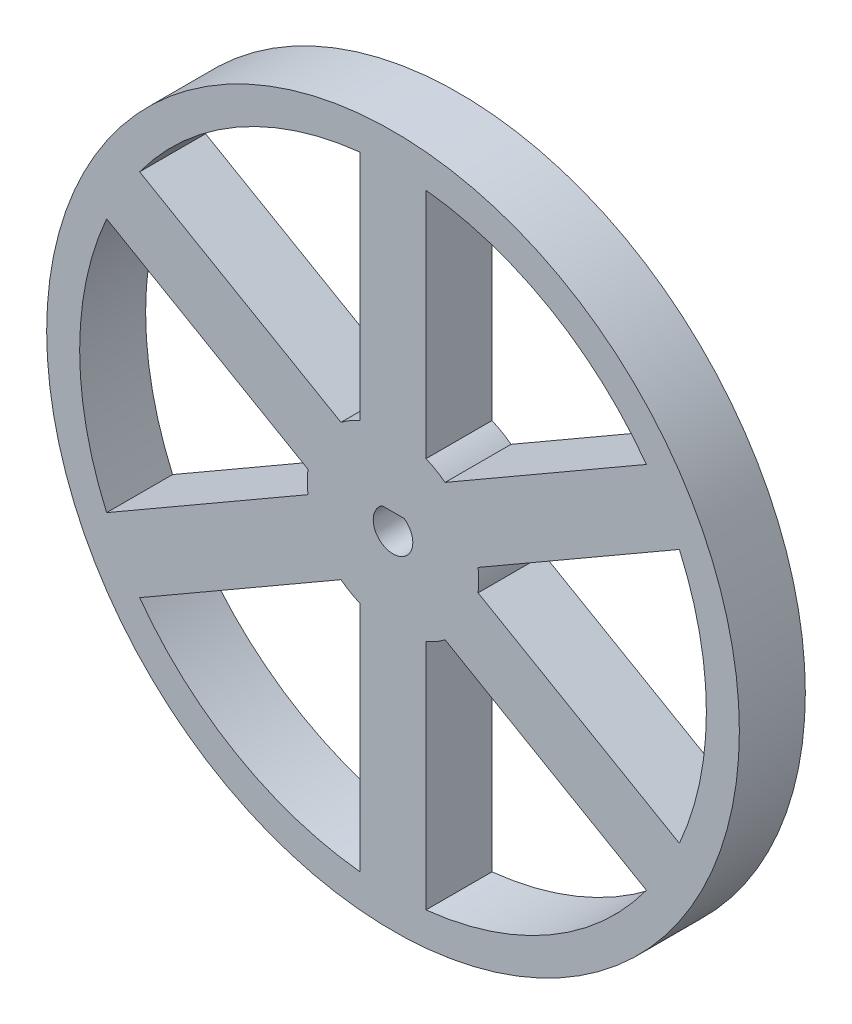
ISO-10303-21;
HEADER;
FILE_DESCRIPTION(('STEP AP214'),'2;1');
FILE_NAME('part.step','',(''),(''),'','','');
FILE_SCHEMA(('AUTOMOTIVE_DESIGN { 1 0 10303 214 1 1 1 1 }'));
ENDSEC;
DATA;
#1=APPLICATION_CONTEXT('core data for automotive mechanical design processes');
#2=APPLICATION_PROTOCOL_DEFINITION('international standard','automotive_design',2000,#1);
#3=PRODUCT_CONTEXT('',#1,'mechanical');
#4=PRODUCT('Part','Part','',(#3));
#5=PRODUCT_RELATED_PRODUCT_CATEGORY('part','',(#4));
#6=PRODUCT_DEFINITION_FORMATION('','',#4);
#7=PRODUCT_DEFINITION_CONTEXT('part definition',#1,'design');
#8=PRODUCT_DEFINITION('design','',#6,#7);
#9=PRODUCT_DEFINITION_SHAPE('','',#8);
#10=(LENGTH_UNIT() NAMED_UNIT(*) SI_UNIT(.MILLI.,.METRE.));
#11=(NAMED_UNIT(*) PLANE_ANGLE_UNIT() SI_UNIT($,.RADIAN.));
#12=(NAMED_UNIT(*) SI_UNIT($,.STERADIAN.) SOLID_ANGLE_UNIT());
#13=UNCERTAINTY_MEASURE_WITH_UNIT(LENGTH_MEASURE(1.E-05),#10,'distance_accuracy_value','');
#14=(GEOMETRIC_REPRESENTATION_CONTEXT(3) GLOBAL_UNCERTAINTY_ASSIGNED_CONTEXT((#13)) GLOBAL_UNIT_ASSIGNED_CONTEXT((#10,
#11,#12)) REPRESENTATION_CONTEXT('',''));
#15=CARTESIAN_POINT('',(0.,0.,0.));
#16=DIRECTION('',(0.,0.,1.));
#17=DIRECTION('',(1.,0.,0.));
#18=AXIS2_PLACEMENT_3D('',#15,#16,#17);
#19=CARTESIAN_POINT('',(0.,0.,10.));
#20=DIRECTION('',(0.,0.,-1.));
#21=DIRECTION('',(-1.,0.,0.));
#22=AXIS2_PLACEMENT_3D('',#19,#20,#21);
#23=CYLINDRICAL_SURFACE('',#22,3.);
#24=CARTESIAN_POINT('',(0.,0.,0.));
#25=DIRECTION('',(0.,0.,1.));
#26=DIRECTION('',(1.,0.,0.));
#27=AXIS2_PLACEMENT_3D('',#24,#25,#26);
#28=CIRCLE('',#27,3.);
#29=CARTESIAN_POINT('',(-1.6583123951777,2.5,0.));
#30=VERTEX_POINT('',#29);
#31=CARTESIAN_POINT('',(1.6583123951777,2.5,0.));
#32=VERTEX_POINT('',#31);
#33=EDGE_CURVE('E412',#30,#32,#28,.T.);
#34=ORIENTED_EDGE('',*,*,#33,.F.);
#35=DIRECTION('',(0.,0.,-1.));
#36=VECTOR('',#35,1.);
#37=CARTESIAN_POINT('',(-1.6583123951777,2.5,10.));
#38=LINE('',#37,#36);
#39=CARTESIAN_POINT('',(-1.6583123951777,2.5,10.));
#40=VERTEX_POINT('',#39);
#41=EDGE_CURVE('E11',#40,#30,#38,.T.);
#42=ORIENTED_EDGE('',*,*,#41,.F.);
#43=CARTESIAN_POINT('',(0.,0.,10.));
#44=DIRECTION('',(0.,0.,1.));
#45=DIRECTION('',(1.,0.,0.));
#46=AXIS2_PLACEMENT_3D('',#43,#44,#45);
#47=CIRCLE('',#46,3.);
#48=CARTESIAN_POINT('',(1.6583123951777,2.5,10.));
#49=VERTEX_POINT('',#48);
#50=EDGE_CURVE('E241',#40,#49,#47,.T.);
#51=ORIENTED_EDGE('',*,*,#50,.T.);
#52=DIRECTION('',(0.,0.,-1.));
#53=VECTOR('',#52,1.);
#54=CARTESIAN_POINT('',(1.6583123951777,2.5,10.));
#55=LINE('',#54,#53);
#56=EDGE_CURVE('E58',#49,#32,#55,.T.);
#57=ORIENTED_EDGE('',*,*,#56,.T.);
#58=EDGE_LOOP('',(#34,#42,#51,#57));
#59=FACE_BOUND('',#58,.T.);
#60=ADVANCED_FACE('F47',(#59),#23,.F.);
#61=CARTESIAN_POINT('',(0.,0.,10.));
#62=DIRECTION('',(0.,0.,-1.));
#63=DIRECTION('',(-1.,0.,0.));
#64=AXIS2_PLACEMENT_3D('',#61,#62,#63);
#65=CYLINDRICAL_SURFACE('',#64,13.);
#66=CARTESIAN_POINT('',(0.,0.,0.));
#67=DIRECTION('',(0.,0.,1.));
#68=DIRECTION('',(1.,0.,0.));
#69=AXIS2_PLACEMENT_3D('',#66,#67,#68);
#70=CIRCLE('',#69,13.);
#71=CARTESIAN_POINT('',(7.89230484541326,10.3301270189222,0.));
#72=VERTEX_POINT('',#71);
#73=CARTESIAN_POINT('',(5.,12.,0.));
#74=VERTEX_POINT('',#73);
#75=EDGE_CURVE('E353',#72,#74,#70,.T.);
#76=ORIENTED_EDGE('',*,*,#75,.T.);
#77=DIRECTION('',(0.,0.,-1.));
#78=VECTOR('',#77,1.);
#79=CARTESIAN_POINT('',(5.,12.,10.));
#80=LINE('',#79,#78);
#81=CARTESIAN_POINT('',(5.,12.,10.));
#82=VERTEX_POINT('',#81);
#83=EDGE_CURVE('E256',#82,#74,#80,.T.);
#84=ORIENTED_EDGE('',*,*,#83,.F.);
#85=CARTESIAN_POINT('',(0.,0.,10.));
#86=DIRECTION('',(0.,0.,1.));
#87=DIRECTION('',(1.,0.,0.));
#88=AXIS2_PLACEMENT_3D('',#85,#86,#87);
#89=CIRCLE('',#88,13.);
#90=CARTESIAN_POINT('',(7.89230484541326,10.3301270189222,10.));
#91=VERTEX_POINT('',#90);
#92=EDGE_CURVE('E235',#91,#82,#89,.T.);
#93=ORIENTED_EDGE('',*,*,#92,.F.);
#94=DIRECTION('',(0.,0.,-1.));
#95=VECTOR('',#94,1.);
#96=CARTESIAN_POINT('',(7.89230484541326,10.3301270189222,10.));
#97=LINE('',#96,#95);
#98=EDGE_CURVE('E244',#91,#72,#97,.T.);
#99=ORIENTED_EDGE('',*,*,#98,.T.);
#100=EDGE_LOOP('',(#76,#84,#93,#99));
#101=FACE_BOUND('',#100,.T.);
#102=ADVANCED_FACE('F255',(#101),#65,.T.);
#103=CARTESIAN_POINT('',(5.,0.,10.));
#104=DIRECTION('',(1.,0.,0.));
#105=DIRECTION('',(0.,0.,-1.));
#106=AXIS2_PLACEMENT_3D('',#103,#104,#105);
#107=PLANE('',#106);
#108=DIRECTION('',(0.,-1.,0.));
#109=VECTOR('',#108,1.);
#110=CARTESIAN_POINT('',(5.,0.,0.));
#111=LINE('',#110,#109);
#112=CARTESIAN_POINT('',(5.,47.236109069228,0.));
#113=VERTEX_POINT('',#112);
#114=EDGE_CURVE('E406',#113,#74,#111,.T.);
#115=ORIENTED_EDGE('',*,*,#114,.F.);
#116=DIRECTION('',(0.,0.,-1.));
#117=VECTOR('',#116,1.);
#118=CARTESIAN_POINT('',(5.,47.236109069228,10.));
#119=LINE('',#118,#117);
#120=CARTESIAN_POINT('',(5.,47.236109069228,10.));
#121=VERTEX_POINT('',#120);
#122=EDGE_CURVE('E422',#121,#113,#119,.T.);
#123=ORIENTED_EDGE('',*,*,#122,.F.);
#124=DIRECTION('',(0.,-1.,0.));
#125=VECTOR('',#124,1.);
#126=CARTESIAN_POINT('',(5.,0.,10.));
#127=LINE('',#126,#125);
#128=EDGE_CURVE('E259',#121,#82,#127,.T.);
#129=ORIENTED_EDGE('',*,*,#128,.T.);
#130=ORIENTED_EDGE('',*,*,#83,.T.);
#131=EDGE_LOOP('',(#115,#123,#129,#130));
#132=FACE_BOUND('',#131,.T.);
#133=ADVANCED_FACE('F516',(#132),#107,.T.);
#134=CARTESIAN_POINT('',(0.,0.,10.));
#135=DIRECTION('',(0.,0.,-1.));
#136=DIRECTION('',(-1.,0.,0.));
#137=AXIS2_PLACEMENT_3D('',#134,#135,#136);
#138=CYLINDRICAL_SURFACE('',#137,47.5);
#139=CARTESIAN_POINT('',(0.,0.,0.));
#140=DIRECTION('',(0.,0.,1.));
#141=DIRECTION('',(1.,0.,0.));
#142=AXIS2_PLACEMENT_3D('',#139,#140,#141);
#143=CIRCLE('',#142,47.5);
#144=CARTESIAN_POINT('',(38.4076704298839,27.9481815535362,0.));
#145=VERTEX_POINT('',#144);
#146=EDGE_CURVE('E363',#145,#113,#143,.T.);
#147=ORIENTED_EDGE('',*,*,#146,.F.);
#148=DIRECTION('',(0.,0.,-1.));
#149=VECTOR('',#148,1.);
#150=CARTESIAN_POINT('',(38.4076704298839,27.9481815535362,10.));
#151=LINE('',#150,#149);
#152=CARTESIAN_POINT('',(38.4076704298839,27.9481815535362,10.));
#153=VERTEX_POINT('',#152);
#154=EDGE_CURVE('E252',#153,#145,#151,.T.);
#155=ORIENTED_EDGE('',*,*,#154,.F.);
#156=CARTESIAN_POINT('',(0.,0.,10.));
#157=DIRECTION('',(0.,0.,1.));
#158=DIRECTION('',(1.,0.,0.));
#159=AXIS2_PLACEMENT_3D('',#156,#157,#158);
#160=CIRCLE('',#159,47.5);
#161=EDGE_CURVE('E238',#153,#121,#160,.T.);
#162=ORIENTED_EDGE('',*,*,#161,.T.);
#163=ORIENTED_EDGE('',*,*,#122,.T.);
#164=EDGE_LOOP('',(#147,#155,#162,#163));
#165=FACE_BOUND('',#164,.T.);
#166=ADVANCED_FACE('F522',(#165),#138,.F.);
#167=CARTESIAN_POINT('',(-5.,0.,10.));
#168=DIRECTION('',(1.,0.,0.));
#169=DIRECTION('',(0.,0.,-1.));
#170=AXIS2_PLACEMENT_3D('',#167,#168,#169);
#171=PLANE('',#170);
#172=DIRECTION('',(0.,-1.,0.));
#173=VECTOR('',#172,1.);
#174=CARTESIAN_POINT('',(-5.,0.,0.));
#175=LINE('',#174,#173);
#176=CARTESIAN_POINT('',(-5.,47.236109069228,0.));
#177=VERTEX_POINT('',#176);
#178=CARTESIAN_POINT('',(-5.,12.,0.));
#179=VERTEX_POINT('',#178);
#180=EDGE_CURVE('E392',#177,#179,#175,.T.);
#181=ORIENTED_EDGE('',*,*,#180,.T.);
#182=DIRECTION('',(0.,0.,-1.));
#183=VECTOR('',#182,1.);
#184=CARTESIAN_POINT('',(-5.,12.,10.));
#185=LINE('',#184,#183);
#186=CARTESIAN_POINT('',(-5.,12.,10.));
#187=VERTEX_POINT('',#186);
#188=EDGE_CURVE('E253',#187,#179,#185,.T.);
#189=ORIENTED_EDGE('',*,*,#188,.F.);
#190=DIRECTION('',(0.,-1.,0.));
#191=VECTOR('',#190,1.);
#192=CARTESIAN_POINT('',(-5.,0.,10.));
#193=LINE('',#192,#191);
#194=CARTESIAN_POINT('',(-5.,47.236109069228,10.));
#195=VERTEX_POINT('',#194);
#196=EDGE_CURVE('E273',#195,#187,#193,.T.);
#197=ORIENTED_EDGE('',*,*,#196,.F.);
#198=DIRECTION('',(0.,0.,-1.));
#199=VECTOR('',#198,1.);
#200=CARTESIAN_POINT('',(-5.,47.236109069228,10.));
#201=LINE('',#200,#199);
#202=EDGE_CURVE('E427',#195,#177,#201,.T.);
#203=ORIENTED_EDGE('',*,*,#202,.T.);
#204=EDGE_LOOP('',(#181,#189,#197,#203));
#205=FACE_BOUND('',#204,.T.);
#206=ADVANCED_FACE('F525',(#205),#171,.F.);
#207=CARTESIAN_POINT('',(-7.89230484541327,10.3301270189222,0.));
#208=VERTEX_POINT('',#207);
#209=EDGE_CURVE('E396',#179,#208,#70,.T.);
#210=ORIENTED_EDGE('',*,*,#209,.T.);
#211=DIRECTION('',(0.,0.,-1.));
#212=VECTOR('',#211,1.);
#213=CARTESIAN_POINT('',(-7.89230484541327,10.3301270189222,10.));
#214=LINE('',#213,#212);
#215=CARTESIAN_POINT('',(-7.89230484541327,10.3301270189222,10.));
#216=VERTEX_POINT('',#215);
#217=EDGE_CURVE('E434',#216,#208,#214,.T.);
#218=ORIENTED_EDGE('',*,*,#217,.F.);
#219=EDGE_CURVE('E262',#187,#216,#89,.T.);
#220=ORIENTED_EDGE('',*,*,#219,.F.);
#221=ORIENTED_EDGE('',*,*,#188,.T.);
#222=EDGE_LOOP('',(#210,#218,#220,#221));
#223=FACE_BOUND('',#222,.T.);
#224=ADVANCED_FACE('F517',(#223),#65,.T.);
#225=CARTESIAN_POINT('',(2.5,4.3301270189222,10.));
#226=DIRECTION('',(0.499999999999999,0.866025403784439,0.));
#227=DIRECTION('',(-0.866025403784439,0.499999999999999,0.));
#228=AXIS2_PLACEMENT_3D('',#225,#226,#227);
#229=PLANE('',#228);
#230=DIRECTION('',(0.866025403784439,-0.499999999999999,0.));
#231=VECTOR('',#230,1.);
#232=CARTESIAN_POINT('',(2.5,4.3301270189222,0.));
#233=LINE('',#232,#231);
#234=CARTESIAN_POINT('',(-38.407670429884,27.9481815535361,0.));
#235=VERTEX_POINT('',#234);
#236=EDGE_CURVE('E397',#235,#208,#233,.T.);
#237=ORIENTED_EDGE('',*,*,#236,.F.);
#238=DIRECTION('',(0.,0.,-1.));
#239=VECTOR('',#238,1.);
#240=CARTESIAN_POINT('',(-38.407670429884,27.9481815535361,10.));
#241=LINE('',#240,#239);
#242=CARTESIAN_POINT('',(-38.407670429884,27.9481815535361,10.));
#243=VERTEX_POINT('',#242);
#244=EDGE_CURVE('E430',#243,#235,#241,.T.);
#245=ORIENTED_EDGE('',*,*,#244,.F.);
#246=DIRECTION('',(0.866025403784439,-0.499999999999999,0.));
#247=VECTOR('',#246,1.);
#248=CARTESIAN_POINT('',(2.5,4.3301270189222,10.));
#249=LINE('',#248,#247);
#250=EDGE_CURVE('E272',#243,#216,#249,.T.);
#251=ORIENTED_EDGE('',*,*,#250,.T.);
#252=ORIENTED_EDGE('',*,*,#217,.T.);
#253=EDGE_LOOP('',(#237,#245,#251,#252));
#254=FACE_BOUND('',#253,.T.);
#255=ADVANCED_FACE('F534',(#254),#229,.T.);
#256=CARTESIAN_POINT('',(-2.5,-4.33012701892219,10.));
#257=DIRECTION('',(0.499999999999999,0.866025403784439,0.));
#258=DIRECTION('',(-0.866025403784439,0.499999999999999,0.));
#259=AXIS2_PLACEMENT_3D('',#256,#257,#258);
#260=PLANE('',#259);
#261=DIRECTION('',(0.866025403784439,-0.499999999999999,0.));
#262=VECTOR('',#261,1.);
#263=CARTESIAN_POINT('',(-2.5,-4.33012701892219,0.));
#264=LINE('',#263,#262);
#265=CARTESIAN_POINT('',(-43.407670429884,19.2879275156918,0.));
#266=VERTEX_POINT('',#265);
#267=CARTESIAN_POINT('',(-12.8923048454133,1.6698729810778,0.));
#268=VERTEX_POINT('',#267);
#269=EDGE_CURVE('E382',#266,#268,#264,.T.);
#270=ORIENTED_EDGE('',*,*,#269,.T.);
#271=DIRECTION('',(0.,0.,-1.));
#272=VECTOR('',#271,1.);
#273=CARTESIAN_POINT('',(-12.8923048454133,1.6698729810778,10.));
#274=LINE('',#273,#272);
#275=CARTESIAN_POINT('',(-12.8923048454133,1.6698729810778,10.));
#276=VERTEX_POINT('',#275);
#277=EDGE_CURVE('E431',#276,#268,#274,.T.);
#278=ORIENTED_EDGE('',*,*,#277,.F.);
#279=DIRECTION('',(0.866025403784439,-0.499999999999999,0.));
#280=VECTOR('',#279,1.);
#281=CARTESIAN_POINT('',(-2.5,-4.33012701892219,10.));
#282=LINE('',#281,#280);
#283=CARTESIAN_POINT('',(-43.407670429884,19.2879275156918,10.));
#284=VERTEX_POINT('',#283);
#285=EDGE_CURVE('E315',#284,#276,#282,.T.);
#286=ORIENTED_EDGE('',*,*,#285,.F.);
#287=DIRECTION('',(0.,0.,-1.));
#288=VECTOR('',#287,1.);
#289=CARTESIAN_POINT('',(-43.407670429884,19.2879275156918,10.));
#290=LINE('',#289,#288);
#291=EDGE_CURVE('E440',#284,#266,#290,.T.);
#292=ORIENTED_EDGE('',*,*,#291,.T.);
#293=EDGE_LOOP('',(#270,#278,#286,#292));
#294=FACE_BOUND('',#293,.T.);
#295=ADVANCED_FACE('F537',(#294),#260,.F.);
#296=CARTESIAN_POINT('',(-12.8923048454133,-1.66987298107781,0.));
#297=VERTEX_POINT('',#296);
#298=EDGE_CURVE('E386',#268,#297,#70,.T.);
#299=ORIENTED_EDGE('',*,*,#298,.T.);
#300=DIRECTION('',(0.,0.,-1.));
#301=VECTOR('',#300,1.);
#302=CARTESIAN_POINT('',(-12.8923048454133,-1.66987298107781,10.));
#303=LINE('',#302,#301);
#304=CARTESIAN_POINT('',(-12.8923048454133,-1.66987298107781,10.));
#305=VERTEX_POINT('',#304);
#306=EDGE_CURVE('E447',#305,#297,#303,.T.);
#307=ORIENTED_EDGE('',*,*,#306,.F.);
#308=EDGE_CURVE('E274',#276,#305,#89,.T.);
#309=ORIENTED_EDGE('',*,*,#308,.F.);
#310=ORIENTED_EDGE('',*,*,#277,.T.);
#311=EDGE_LOOP('',(#299,#307,#309,#310));
#312=FACE_BOUND('',#311,.T.);
#313=ADVANCED_FACE('F546',(#312),#65,.T.);
#314=CARTESIAN_POINT('',(-2.5,4.33012701892219,10.));
#315=DIRECTION('',(-0.5,0.866025403784438,0.));
#316=DIRECTION('',(-0.866025403784438,-0.5,0.));
#317=AXIS2_PLACEMENT_3D('',#314,#315,#316);
#318=PLANE('',#317);
#319=DIRECTION('',(0.866025403784438,0.5,0.));
#320=VECTOR('',#319,1.);
#321=CARTESIAN_POINT('',(-2.5,4.33012701892219,0.));
#322=LINE('',#321,#320);
#323=CARTESIAN_POINT('',(-43.4076704298839,-19.2879275156918,0.));
#324=VERTEX_POINT('',#323);
#325=EDGE_CURVE('E387',#324,#297,#322,.T.);
#326=ORIENTED_EDGE('',*,*,#325,.F.);
#327=DIRECTION('',(0.,0.,-1.));
#328=VECTOR('',#327,1.);
#329=CARTESIAN_POINT('',(-43.4076704298839,-19.2879275156918,10.));
#330=LINE('',#329,#328);
#331=CARTESIAN_POINT('',(-43.4076704298839,-19.2879275156918,10.));
#332=VERTEX_POINT('',#331);
#333=EDGE_CURVE('E443',#332,#324,#330,.T.);
#334=ORIENTED_EDGE('',*,*,#333,.F.);
#335=DIRECTION('',(0.866025403784438,0.5,0.));
#336=VECTOR('',#335,1.);
#337=CARTESIAN_POINT('',(-2.5,4.33012701892219,10.));
#338=LINE('',#337,#336);
#339=EDGE_CURVE('E314',#332,#305,#338,.T.);
#340=ORIENTED_EDGE('',*,*,#339,.T.);
#341=ORIENTED_EDGE('',*,*,#306,.T.);
#342=EDGE_LOOP('',(#326,#334,#340,#341));
#343=FACE_BOUND('',#342,.T.);
#344=ADVANCED_FACE('F542',(#343),#318,.T.);
#345=CARTESIAN_POINT('',(2.5,-4.33012701892219,10.));
#346=DIRECTION('',(-0.5,0.866025403784438,0.));
#347=DIRECTION('',(-0.866025403784438,-0.5,0.));
#348=AXIS2_PLACEMENT_3D('',#345,#346,#347);
#349=PLANE('',#348);
#350=DIRECTION('',(0.866025403784438,0.5,0.));
#351=VECTOR('',#350,1.);
#352=CARTESIAN_POINT('',(2.5,-4.33012701892219,0.));
#353=LINE('',#352,#351);
#354=CARTESIAN_POINT('',(-38.4076704298839,-27.9481815535362,0.));
#355=VERTEX_POINT('',#354);
#356=CARTESIAN_POINT('',(-7.89230484541326,-10.3301270189222,0.));
#357=VERTEX_POINT('',#356);
#358=EDGE_CURVE('E372',#355,#357,#353,.T.);
#359=ORIENTED_EDGE('',*,*,#358,.T.);
#360=DIRECTION('',(0.,0.,-1.));
#361=VECTOR('',#360,1.);
#362=CARTESIAN_POINT('',(-7.89230484541326,-10.3301270189222,10.));
#363=LINE('',#362,#361);
#364=CARTESIAN_POINT('',(-7.89230484541326,-10.3301270189222,10.));
#365=VERTEX_POINT('',#364);
#366=EDGE_CURVE('E444',#365,#357,#363,.T.);
#367=ORIENTED_EDGE('',*,*,#366,.F.);
#368=DIRECTION('',(0.866025403784438,0.5,0.));
#369=VECTOR('',#368,1.);
#370=CARTESIAN_POINT('',(2.5,-4.33012701892219,10.));
#371=LINE('',#370,#369);
#372=CARTESIAN_POINT('',(-38.4076704298839,-27.9481815535362,10.));
#373=VERTEX_POINT('',#372);
#374=EDGE_CURVE('E302',#373,#365,#371,.T.);
#375=ORIENTED_EDGE('',*,*,#374,.F.);
#376=DIRECTION('',(0.,0.,-1.));
#377=VECTOR('',#376,1.);
#378=CARTESIAN_POINT('',(-38.4076704298839,-27.9481815535362,10.));
#379=LINE('',#378,#377);
#380=EDGE_CURVE('E453',#373,#355,#379,.T.);
#381=ORIENTED_EDGE('',*,*,#380,.T.);
#382=EDGE_LOOP('',(#359,#367,#375,#381));
#383=FACE_BOUND('',#382,.T.);
#384=ADVANCED_FACE('F545',(#383),#349,.F.);
#385=CARTESIAN_POINT('',(-5.,-12.,0.));
#386=VERTEX_POINT('',#385);
#387=EDGE_CURVE('E376',#357,#386,#70,.T.);
#388=ORIENTED_EDGE('',*,*,#387,.T.);
#389=DIRECTION('',(0.,0.,-1.));
#390=VECTOR('',#389,1.);
#391=CARTESIAN_POINT('',(-5.,-12.,10.));
#392=LINE('',#391,#390);
#393=CARTESIAN_POINT('',(-5.,-12.,10.));
#394=VERTEX_POINT('',#393);
#395=EDGE_CURVE('E460',#394,#386,#392,.T.);
#396=ORIENTED_EDGE('',*,*,#395,.F.);
#397=EDGE_CURVE('E289',#365,#394,#89,.T.);
#398=ORIENTED_EDGE('',*,*,#397,.F.);
#399=ORIENTED_EDGE('',*,*,#366,.T.);
#400=EDGE_LOOP('',(#388,#396,#398,#399));
#401=FACE_BOUND('',#400,.T.);
#402=ADVANCED_FACE('F555',(#401),#65,.T.);
#403=CARTESIAN_POINT('',(-4.99999999999999,0.,10.));
#404=DIRECTION('',(-1.,0.,0.));
#405=DIRECTION('',(0.,-1.,0.));
#406=AXIS2_PLACEMENT_3D('',#403,#404,#405);
#407=PLANE('',#406);
#408=DIRECTION('',(0.,1.,0.));
#409=VECTOR('',#408,1.);
#410=CARTESIAN_POINT('',(-4.99999999999999,0.,0.));
#411=LINE('',#410,#409);
#412=CARTESIAN_POINT('',(-5.,-47.236109069228,0.));
#413=VERTEX_POINT('',#412);
#414=EDGE_CURVE('E377',#413,#386,#411,.T.);
#415=ORIENTED_EDGE('',*,*,#414,.F.);
#416=DIRECTION('',(0.,0.,-1.));
#417=VECTOR('',#416,1.);
#418=CARTESIAN_POINT('',(-5.,-47.236109069228,10.));
#419=LINE('',#418,#417);
#420=CARTESIAN_POINT('',(-5.,-47.236109069228,10.));
#421=VERTEX_POINT('',#420);
#422=EDGE_CURVE('E456',#421,#413,#419,.T.);
#423=ORIENTED_EDGE('',*,*,#422,.F.);
#424=DIRECTION('',(0.,1.,0.));
#425=VECTOR('',#424,1.);
#426=CARTESIAN_POINT('',(-4.99999999999999,0.,10.));
#427=LINE('',#426,#425);
#428=EDGE_CURVE('E301',#421,#394,#427,.T.);
#429=ORIENTED_EDGE('',*,*,#428,.T.);
#430=ORIENTED_EDGE('',*,*,#395,.T.);
#431=EDGE_LOOP('',(#415,#423,#429,#430));
#432=FACE_BOUND('',#431,.T.);
#433=ADVANCED_FACE('F551',(#432),#407,.T.);
#434=CARTESIAN_POINT('',(5.00000000000001,0.,10.));
#435=DIRECTION('',(-1.,0.,0.));
#436=DIRECTION('',(0.,-1.,0.));
#437=AXIS2_PLACEMENT_3D('',#434,#435,#436);
#438=PLANE('',#437);
#439=DIRECTION('',(0.,1.,0.));
#440=VECTOR('',#439,1.);
#441=CARTESIAN_POINT('',(5.00000000000001,0.,0.));
#442=LINE('',#441,#440);
#443=CARTESIAN_POINT('',(5.,-47.236109069228,0.));
#444=VERTEX_POINT('',#443);
#445=CARTESIAN_POINT('',(5.00000000000001,-12.,0.));
#446=VERTEX_POINT('',#445);
#447=EDGE_CURVE('E362',#444,#446,#442,.T.);
#448=ORIENTED_EDGE('',*,*,#447,.T.);
#449=DIRECTION('',(0.,0.,-1.));
#450=VECTOR('',#449,1.);
#451=CARTESIAN_POINT('',(5.00000000000001,-12.,10.));
#452=LINE('',#451,#450);
#453=CARTESIAN_POINT('',(5.00000000000001,-12.,10.));
#454=VERTEX_POINT('',#453);
#455=EDGE_CURVE('E457',#454,#446,#452,.T.);
#456=ORIENTED_EDGE('',*,*,#455,.F.);
#457=DIRECTION('',(0.,1.,0.));
#458=VECTOR('',#457,1.);
#459=CARTESIAN_POINT('',(5.00000000000001,0.,10.));
#460=LINE('',#459,#458);
#461=CARTESIAN_POINT('',(5.,-47.236109069228,10.));
#462=VERTEX_POINT('',#461);
#463=EDGE_CURVE('E288',#462,#454,#460,.T.);
#464=ORIENTED_EDGE('',*,*,#463,.F.);
#465=DIRECTION('',(0.,0.,-1.));
#466=VECTOR('',#465,1.);
#467=CARTESIAN_POINT('',(5.,-47.236109069228,10.));
#468=LINE('',#467,#466);
#469=EDGE_CURVE('E466',#462,#444,#468,.T.);
#470=ORIENTED_EDGE('',*,*,#469,.T.);
#471=EDGE_LOOP('',(#448,#456,#464,#470));
#472=FACE_BOUND('',#471,.T.);
#473=ADVANCED_FACE('F554',(#472),#438,.F.);
#474=CARTESIAN_POINT('',(7.89230484541327,-10.3301270189222,0.));
#475=VERTEX_POINT('',#474);
#476=EDGE_CURVE('E354',#446,#475,#70,.T.);
#477=ORIENTED_EDGE('',*,*,#476,.T.);
#478=DIRECTION('',(0.,0.,-1.));
#479=VECTOR('',#478,1.);
#480=CARTESIAN_POINT('',(7.89230484541327,-10.3301270189222,10.));
#481=LINE('',#480,#479);
#482=CARTESIAN_POINT('',(7.89230484541327,-10.3301270189222,10.));
#483=VERTEX_POINT('',#482);
#484=EDGE_CURVE('E472',#483,#475,#481,.T.);
#485=ORIENTED_EDGE('',*,*,#484,.F.);
#486=EDGE_CURVE('E278',#454,#483,#89,.T.);
#487=ORIENTED_EDGE('',*,*,#486,.F.);
#488=ORIENTED_EDGE('',*,*,#455,.T.);
#489=EDGE_LOOP('',(#477,#485,#487,#488));
#490=FACE_BOUND('',#489,.T.);
#491=ADVANCED_FACE('F509',(#490),#65,.T.);
#492=CARTESIAN_POINT('',(-2.5,-4.33012701892218,10.));
#493=DIRECTION('',(-0.5,-0.866025403784438,0.));
#494=DIRECTION('',(0.866025403784439,-0.5,0.));
#495=AXIS2_PLACEMENT_3D('',#492,#493,#494);
#496=PLANE('',#495);
#497=DIRECTION('',(-0.866025403784439,0.5,0.));
#498=VECTOR('',#497,1.);
#499=CARTESIAN_POINT('',(-2.5,-4.33012701892218,0.));
#500=LINE('',#499,#498);
#501=CARTESIAN_POINT('',(38.4076704298839,-27.9481815535362,0.));
#502=VERTEX_POINT('',#501);
#503=EDGE_CURVE('E368',#502,#475,#500,.T.);
#504=ORIENTED_EDGE('',*,*,#503,.F.);
#505=DIRECTION('',(0.,0.,-1.));
#506=VECTOR('',#505,1.);
#507=CARTESIAN_POINT('',(38.4076704298839,-27.9481815535362,10.));
#508=LINE('',#507,#506);
#509=CARTESIAN_POINT('',(38.4076704298839,-27.9481815535362,10.));
#510=VERTEX_POINT('',#509);
#511=EDGE_CURVE('E469',#510,#502,#508,.T.);
#512=ORIENTED_EDGE('',*,*,#511,.F.);
#513=DIRECTION('',(-0.866025403784439,0.5,0.));
#514=VECTOR('',#513,1.);
#515=CARTESIAN_POINT('',(-2.5,-4.33012701892218,10.));
#516=LINE('',#515,#514);
#517=EDGE_CURVE('E287',#510,#483,#516,.T.);
#518=ORIENTED_EDGE('',*,*,#517,.T.);
#519=ORIENTED_EDGE('',*,*,#484,.T.);
#520=EDGE_LOOP('',(#504,#512,#518,#519));
#521=FACE_BOUND('',#520,.T.);
#522=ADVANCED_FACE('F560',(#521),#496,.T.);
#523=CARTESIAN_POINT('',(2.50000000000001,4.33012701892221,10.));
#524=DIRECTION('',(-0.5,-0.866025403784438,0.));
#525=DIRECTION('',(0.866025403784439,-0.5,0.));
#526=AXIS2_PLACEMENT_3D('',#523,#524,#525);
#527=PLANE('',#526);
#528=DIRECTION('',(-0.866025403784439,0.5,0.));
#529=VECTOR('',#528,1.);
#530=CARTESIAN_POINT('',(2.50000000000001,4.33012701892221,0.));
#531=LINE('',#530,#529);
#532=CARTESIAN_POINT('',(43.4076704298839,-19.2879275156918,0.));
#533=VERTEX_POINT('',#532);
#534=CARTESIAN_POINT('',(12.8923048454133,-1.66987298107779,0.));
#535=VERTEX_POINT('',#534);
#536=EDGE_CURVE('E344',#533,#535,#531,.T.);
#537=ORIENTED_EDGE('',*,*,#536,.T.);
#538=DIRECTION('',(0.,0.,-1.));
#539=VECTOR('',#538,1.);
#540=CARTESIAN_POINT('',(12.8923048454133,-1.66987298107779,10.));
#541=LINE('',#540,#539);
#542=CARTESIAN_POINT('',(12.8923048454133,-1.66987298107779,10.));
#543=VERTEX_POINT('',#542);
#544=EDGE_CURVE('E51',#543,#535,#541,.T.);
#545=ORIENTED_EDGE('',*,*,#544,.F.);
#546=DIRECTION('',(-0.866025403784439,0.5,0.));
#547=VECTOR('',#546,1.);
#548=CARTESIAN_POINT('',(2.50000000000001,4.33012701892221,10.));
#549=LINE('',#548,#547);
#550=CARTESIAN_POINT('',(43.4076704298839,-19.2879275156918,10.));
#551=VERTEX_POINT('',#550);
#552=EDGE_CURVE('E277',#551,#543,#549,.T.);
#553=ORIENTED_EDGE('',*,*,#552,.F.);
#554=DIRECTION('',(0.,0.,-1.));
#555=VECTOR('',#554,1.);
#556=CARTESIAN_POINT('',(43.4076704298839,-19.2879275156918,10.));
#557=LINE('',#556,#555);
#558=EDGE_CURVE('E343',#551,#533,#557,.T.);
#559=ORIENTED_EDGE('',*,*,#558,.T.);
#560=EDGE_LOOP('',(#537,#545,#553,#559));
#561=FACE_BOUND('',#560,.T.);
#562=ADVANCED_FACE('F49',(#561),#527,.F.);
#563=CARTESIAN_POINT('',(12.8923048454133,1.66987298107781,0.));
#564=VERTEX_POINT('',#563);
#565=EDGE_CURVE('E348',#535,#564,#70,.T.);
#566=ORIENTED_EDGE('',*,*,#565,.T.);
#567=DIRECTION('',(0.,0.,-1.));
#568=VECTOR('',#567,1.);
#569=CARTESIAN_POINT('',(12.8923048454133,1.66987298107781,10.));
#570=LINE('',#569,#568);
#571=CARTESIAN_POINT('',(12.8923048454133,1.66987298107781,10.));
#572=VERTEX_POINT('',#571);
#573=EDGE_CURVE('E482',#572,#564,#570,.T.);
#574=ORIENTED_EDGE('',*,*,#573,.F.);
#575=EDGE_CURVE('E160',#543,#572,#89,.T.);
#576=ORIENTED_EDGE('',*,*,#575,.F.);
#577=ORIENTED_EDGE('',*,*,#544,.T.);
#578=EDGE_LOOP('',(#566,#574,#576,#577));
#579=FACE_BOUND('',#578,.T.);
#580=ADVANCED_FACE('F488',(#579),#65,.T.);
#581=CARTESIAN_POINT('',(2.5,-4.33012701892219,10.));
#582=DIRECTION('',(0.5,-0.866025403784439,0.));
#583=DIRECTION('',(0.866025403784439,0.5,0.));
#584=AXIS2_PLACEMENT_3D('',#581,#582,#583);
#585=PLANE('',#584);
#586=DIRECTION('',(-0.866025403784439,-0.5,0.));
#587=VECTOR('',#586,1.);
#588=CARTESIAN_POINT('',(2.5,-4.33012701892219,0.));
#589=LINE('',#588,#587);
#590=CARTESIAN_POINT('',(43.4076704298839,19.2879275156918,0.));
#591=VERTEX_POINT('',#590);
#592=EDGE_CURVE('E352',#591,#564,#589,.T.);
#593=ORIENTED_EDGE('',*,*,#592,.F.);
#594=DIRECTION('',(0.,0.,-1.));
#595=VECTOR('',#594,1.);
#596=CARTESIAN_POINT('',(43.4076704298839,19.2879275156918,10.));
#597=LINE('',#596,#595);
#598=CARTESIAN_POINT('',(43.4076704298839,19.2879275156918,10.));
#599=VERTEX_POINT('',#598);
#600=EDGE_CURVE('E480',#599,#591,#597,.T.);
#601=ORIENTED_EDGE('',*,*,#600,.F.);
#602=DIRECTION('',(-0.866025403784439,-0.5,0.));
#603=VECTOR('',#602,1.);
#604=CARTESIAN_POINT('',(2.5,-4.33012701892219,10.));
#605=LINE('',#604,#603);
#606=EDGE_CURVE('E276',#599,#572,#605,.T.);
#607=ORIENTED_EDGE('',*,*,#606,.T.);
#608=ORIENTED_EDGE('',*,*,#573,.T.);
#609=EDGE_LOOP('',(#593,#601,#607,#608));
#610=FACE_BOUND('',#609,.T.);
#611=ADVANCED_FACE('F500',(#610),#585,.T.);
#612=CARTESIAN_POINT('',(-2.5,4.3301270189222,10.));
#613=DIRECTION('',(0.5,-0.866025403784439,0.));
#614=DIRECTION('',(0.866025403784439,0.5,0.));
#615=AXIS2_PLACEMENT_3D('',#612,#613,#614);
#616=PLANE('',#615);
#617=DIRECTION('',(-0.866025403784439,-0.5,0.));
#618=VECTOR('',#617,1.);
#619=CARTESIAN_POINT('',(-2.5,4.3301270189222,0.));
#620=LINE('',#619,#618);
#621=EDGE_CURVE('E247',#145,#72,#620,.T.);
#622=ORIENTED_EDGE('',*,*,#621,.T.);
#623=ORIENTED_EDGE('',*,*,#98,.F.);
#624=DIRECTION('',(-0.866025403784439,-0.5,0.));
#625=VECTOR('',#624,1.);
#626=CARTESIAN_POINT('',(-2.5,4.3301270189222,10.));
#627=LINE('',#626,#625);
#628=EDGE_CURVE('E230',#153,#91,#627,.T.);
#629=ORIENTED_EDGE('',*,*,#628,.F.);
#630=ORIENTED_EDGE('',*,*,#154,.T.);
#631=EDGE_LOOP('',(#622,#623,#629,#630));
#632=FACE_BOUND('',#631,.T.);
#633=ADVANCED_FACE('F245',(#632),#616,.F.);
#634=CARTESIAN_POINT('',(0.,0.,10.));
#635=DIRECTION('',(0.,0.,-1.));
#636=DIRECTION('',(-1.,0.,0.));
#637=AXIS2_PLACEMENT_3D('',#634,#635,#636);
#638=CYLINDRICAL_SURFACE('',#637,52.5);
#639=CARTESIAN_POINT('',(0.,0.,10.));
#640=DIRECTION('',(0.,0.,1.));
#641=DIRECTION('',(1.,0.,0.));
#642=AXIS2_PLACEMENT_3D('',#639,#640,#641);
#643=CIRCLE('',#642,52.5);
#644=CARTESIAN_POINT('',(52.5,0.,10.));
#645=VERTEX_POINT('',#644);
#646=EDGE_CURVE('E260',#645,#645,#643,.T.);
#647=ORIENTED_EDGE('',*,*,#646,.F.);
#648=EDGE_LOOP('',(#647));
#649=FACE_BOUND('',#648,.T.);
#650=CARTESIAN_POINT('',(0.,0.,0.));
#651=DIRECTION('',(0.,0.,1.));
#652=DIRECTION('',(1.,0.,0.));
#653=AXIS2_PLACEMENT_3D('',#650,#651,#652);
#654=CIRCLE('',#653,52.5);
#655=CARTESIAN_POINT('',(52.5,0.,0.));
#656=VERTEX_POINT('',#655);
#657=EDGE_CURVE('E402',#656,#656,#654,.T.);
#658=ORIENTED_EDGE('',*,*,#657,.T.);
#659=EDGE_LOOP('',(#658));
#660=FACE_BOUND('',#659,.T.);
#661=ADVANCED_FACE('F506',(#649,#660),#638,.T.);
#662=EDGE_CURVE('E401',#177,#235,#143,.T.);
#663=ORIENTED_EDGE('',*,*,#662,.F.);
#664=ORIENTED_EDGE('',*,*,#202,.F.);
#665=EDGE_CURVE('E267',#195,#243,#160,.T.);
#666=ORIENTED_EDGE('',*,*,#665,.T.);
#667=ORIENTED_EDGE('',*,*,#244,.T.);
#668=EDGE_LOOP('',(#663,#664,#666,#667));
#669=FACE_BOUND('',#668,.T.);
#670=ADVANCED_FACE('F527',(#669),#138,.F.);
#671=EDGE_CURVE('E391',#266,#324,#143,.T.);
#672=ORIENTED_EDGE('',*,*,#671,.F.);
#673=ORIENTED_EDGE('',*,*,#291,.F.);
#674=EDGE_CURVE('E323',#284,#332,#160,.T.);
#675=ORIENTED_EDGE('',*,*,#674,.T.);
#676=ORIENTED_EDGE('',*,*,#333,.T.);
#677=EDGE_LOOP('',(#672,#673,#675,#676));
#678=FACE_BOUND('',#677,.T.);
#679=ADVANCED_FACE('F624',(#678),#138,.F.);
#680=EDGE_CURVE('E381',#355,#413,#143,.T.);
#681=ORIENTED_EDGE('',*,*,#680,.F.);
#682=ORIENTED_EDGE('',*,*,#380,.F.);
#683=EDGE_CURVE('E310',#373,#421,#160,.T.);
#684=ORIENTED_EDGE('',*,*,#683,.T.);
#685=ORIENTED_EDGE('',*,*,#422,.T.);
#686=EDGE_LOOP('',(#681,#682,#684,#685));
#687=FACE_BOUND('',#686,.T.);
#688=ADVANCED_FACE('F703',(#687),#138,.F.);
#689=EDGE_CURVE('E364',#444,#502,#143,.T.);
#690=ORIENTED_EDGE('',*,*,#689,.F.);
#691=ORIENTED_EDGE('',*,*,#469,.F.);
#692=EDGE_CURVE('E297',#462,#510,#160,.T.);
#693=ORIENTED_EDGE('',*,*,#692,.T.);
#694=ORIENTED_EDGE('',*,*,#511,.T.);
#695=EDGE_LOOP('',(#690,#691,#693,#694));
#696=FACE_BOUND('',#695,.T.);
#697=ADVANCED_FACE('F577',(#696),#138,.F.);
#698=EDGE_CURVE('E358',#533,#591,#143,.T.);
#699=ORIENTED_EDGE('',*,*,#698,.F.);
#700=ORIENTED_EDGE('',*,*,#558,.F.);
#701=EDGE_CURVE('E284',#551,#599,#160,.T.);
#702=ORIENTED_EDGE('',*,*,#701,.T.);
#703=ORIENTED_EDGE('',*,*,#600,.T.);
#704=EDGE_LOOP('',(#699,#700,#702,#703));
#705=FACE_BOUND('',#704,.T.);
#706=ADVANCED_FACE('F497',(#705),#138,.F.);
#707=CARTESIAN_POINT('',(0.,2.5,10.));
#708=DIRECTION('',(0.,1.,0.));
#709=DIRECTION('',(0.,0.,1.));
#710=AXIS2_PLACEMENT_3D('',#707,#708,#709);
#711=PLANE('',#710);
#712=DIRECTION('',(1.,0.,0.));
#713=VECTOR('',#712,1.);
#714=CARTESIAN_POINT('',(0.,2.5,0.));
#715=LINE('',#714,#713);
#716=EDGE_CURVE('E285',#30,#32,#715,.T.);
#717=ORIENTED_EDGE('',*,*,#716,.T.);
#718=ORIENTED_EDGE('',*,*,#56,.F.);
#719=DIRECTION('',(1.,0.,0.));
#720=VECTOR('',#719,1.);
#721=CARTESIAN_POINT('',(0.,2.5,10.));
#722=LINE('',#721,#720);
#723=EDGE_CURVE('E66',#40,#49,#722,.T.);
#724=ORIENTED_EDGE('',*,*,#723,.F.);
#725=ORIENTED_EDGE('',*,*,#41,.T.);
#726=EDGE_LOOP('',(#717,#718,#724,#725));
#727=FACE_BOUND('',#726,.T.);
#728=ADVANCED_FACE('F519',(#727),#711,.F.);
#729=CARTESIAN_POINT('',(0.,0.,10.));
#730=DIRECTION('',(0.,0.,1.));
#731=DIRECTION('',(1.,0.,0.));
#732=AXIS2_PLACEMENT_3D('',#729,#730,#731);
#733=PLANE('',#732);
#734=ORIENTED_EDGE('',*,*,#552,.T.);
#735=ORIENTED_EDGE('',*,*,#575,.T.);
#736=ORIENTED_EDGE('',*,*,#606,.F.);
#737=ORIENTED_EDGE('',*,*,#701,.F.);
#738=EDGE_LOOP('',(#734,#735,#736,#737));
#739=FACE_BOUND('',#738,.T.);
#740=ORIENTED_EDGE('',*,*,#463,.T.);
#741=ORIENTED_EDGE('',*,*,#486,.T.);
#742=ORIENTED_EDGE('',*,*,#517,.F.);
#743=ORIENTED_EDGE('',*,*,#692,.F.);
#744=EDGE_LOOP('',(#740,#741,#742,#743));
#745=FACE_BOUND('',#744,.T.);
#746=ORIENTED_EDGE('',*,*,#374,.T.);
#747=ORIENTED_EDGE('',*,*,#397,.T.);
#748=ORIENTED_EDGE('',*,*,#428,.F.);
#749=ORIENTED_EDGE('',*,*,#683,.F.);
#750=EDGE_LOOP('',(#746,#747,#748,#749));
#751=FACE_BOUND('',#750,.T.);
#752=ORIENTED_EDGE('',*,*,#285,.T.);
#753=ORIENTED_EDGE('',*,*,#308,.T.);
#754=ORIENTED_EDGE('',*,*,#339,.F.);
#755=ORIENTED_EDGE('',*,*,#674,.F.);
#756=EDGE_LOOP('',(#752,#753,#754,#755));
#757=FACE_BOUND('',#756,.T.);
#758=ORIENTED_EDGE('',*,*,#196,.T.);
#759=ORIENTED_EDGE('',*,*,#219,.T.);
#760=ORIENTED_EDGE('',*,*,#250,.F.);
#761=ORIENTED_EDGE('',*,*,#665,.F.);
#762=EDGE_LOOP('',(#758,#759,#760,#761));
#763=FACE_BOUND('',#762,.T.);
#764=ORIENTED_EDGE('',*,*,#646,.T.);
#765=EDGE_LOOP('',(#764));
#766=FACE_BOUND('',#765,.T.);
#767=ORIENTED_EDGE('',*,*,#92,.T.);
#768=ORIENTED_EDGE('',*,*,#128,.F.);
#769=ORIENTED_EDGE('',*,*,#161,.F.);
#770=ORIENTED_EDGE('',*,*,#628,.T.);
#771=EDGE_LOOP('',(#767,#768,#769,#770));
#772=FACE_BOUND('',#771,.T.);
#773=ORIENTED_EDGE('',*,*,#50,.F.);
#774=ORIENTED_EDGE('',*,*,#723,.T.);
#775=EDGE_LOOP('',(#773,#774));
#776=FACE_BOUND('',#775,.T.);
#777=ADVANCED_FACE('F232',(#739,#745,#751,#757,#763,#766,#772,#776),#733,.T.);
#778=CARTESIAN_POINT('',(0.,0.,0.));
#779=DIRECTION('',(0.,0.,1.));
#780=DIRECTION('',(1.,0.,0.));
#781=AXIS2_PLACEMENT_3D('',#778,#779,#780);
#782=PLANE('',#781);
#783=ORIENTED_EDGE('',*,*,#536,.F.);
#784=ORIENTED_EDGE('',*,*,#698,.T.);
#785=ORIENTED_EDGE('',*,*,#592,.T.);
#786=ORIENTED_EDGE('',*,*,#565,.F.);
#787=EDGE_LOOP('',(#783,#784,#785,#786));
#788=FACE_BOUND('',#787,.T.);
#789=ORIENTED_EDGE('',*,*,#447,.F.);
#790=ORIENTED_EDGE('',*,*,#689,.T.);
#791=ORIENTED_EDGE('',*,*,#503,.T.);
#792=ORIENTED_EDGE('',*,*,#476,.F.);
#793=EDGE_LOOP('',(#789,#790,#791,#792));
#794=FACE_BOUND('',#793,.T.);
#795=ORIENTED_EDGE('',*,*,#358,.F.);
#796=ORIENTED_EDGE('',*,*,#680,.T.);
#797=ORIENTED_EDGE('',*,*,#414,.T.);
#798=ORIENTED_EDGE('',*,*,#387,.F.);
#799=EDGE_LOOP('',(#795,#796,#797,#798));
#800=FACE_BOUND('',#799,.T.);
#801=ORIENTED_EDGE('',*,*,#269,.F.);
#802=ORIENTED_EDGE('',*,*,#671,.T.);
#803=ORIENTED_EDGE('',*,*,#325,.T.);
#804=ORIENTED_EDGE('',*,*,#298,.F.);
#805=EDGE_LOOP('',(#801,#802,#803,#804));
#806=FACE_BOUND('',#805,.T.);
#807=ORIENTED_EDGE('',*,*,#180,.F.);
#808=ORIENTED_EDGE('',*,*,#662,.T.);
#809=ORIENTED_EDGE('',*,*,#236,.T.);
#810=ORIENTED_EDGE('',*,*,#209,.F.);
#811=EDGE_LOOP('',(#807,#808,#809,#810));
#812=FACE_BOUND('',#811,.T.);
#813=ORIENTED_EDGE('',*,*,#657,.F.);
#814=EDGE_LOOP('',(#813));
#815=FACE_BOUND('',#814,.T.);
#816=ORIENTED_EDGE('',*,*,#75,.F.);
#817=ORIENTED_EDGE('',*,*,#621,.F.);
#818=ORIENTED_EDGE('',*,*,#146,.T.);
#819=ORIENTED_EDGE('',*,*,#114,.T.);
#820=EDGE_LOOP('',(#816,#817,#818,#819));
#821=FACE_BOUND('',#820,.T.);
#822=ORIENTED_EDGE('',*,*,#33,.T.);
#823=ORIENTED_EDGE('',*,*,#716,.F.);
#824=EDGE_LOOP('',(#822,#823));
#825=FACE_BOUND('',#824,.T.);
#826=ADVANCED_FACE('F494',(#788,#794,#800,#806,#812,#815,#821,#825),#782,.F.);
#827=CLOSED_SHELL('',(#60,#102,#133,#166,#206,#224,#255,#295,#313,#344,#384,#402,#433,#473,#491,
#522,#562,#580,#611,#633,#661,#670,#679,#688,#697,#706,#728,#777,#826));
#828=MANIFOLD_SOLID_BREP('B2',#827);
#829=ADVANCED_BREP_SHAPE_REPRESENTATION('',(#18,#828),#14);
#830=SHAPE_DEFINITION_REPRESENTATION(#9,#829);
ENDSEC;
END-ISO-10303-21;
